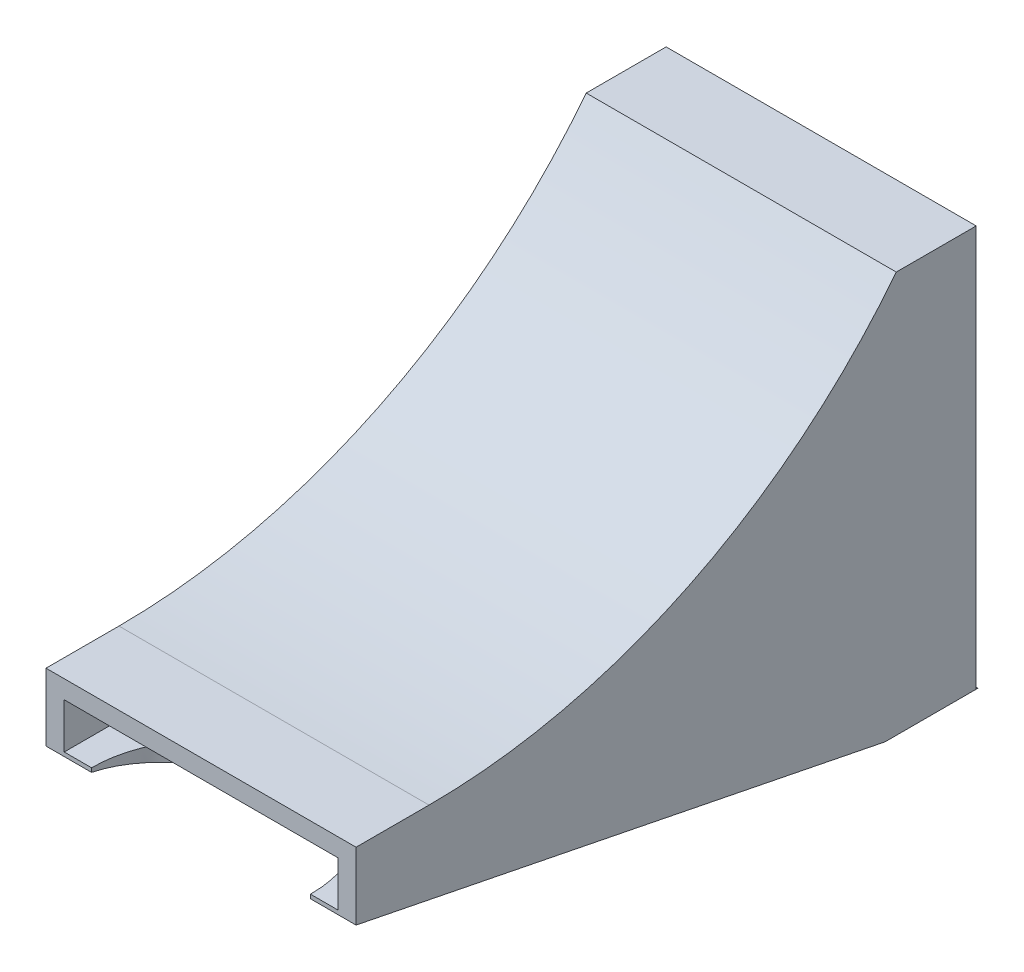
ISO-10303-21;
HEADER;
FILE_DESCRIPTION(('STEP AP214'),'2;1');
FILE_NAME('part.step','',(''),(''),'','','');
FILE_SCHEMA(('AUTOMOTIVE_DESIGN { 1 0 10303 214 1 1 1 1 }'));
ENDSEC;
DATA;
#1=APPLICATION_CONTEXT('core data for automotive mechanical design processes');
#2=APPLICATION_PROTOCOL_DEFINITION('international standard','automotive_design',2000,#1);
#3=PRODUCT_CONTEXT('',#1,'mechanical');
#4=PRODUCT('Part','Part','',(#3));
#5=PRODUCT_RELATED_PRODUCT_CATEGORY('part','',(#4));
#6=PRODUCT_DEFINITION_FORMATION('','',#4);
#7=PRODUCT_DEFINITION_CONTEXT('part definition',#1,'design');
#8=PRODUCT_DEFINITION('design','',#6,#7);
#9=PRODUCT_DEFINITION_SHAPE('','',#8);
#10=(LENGTH_UNIT() NAMED_UNIT(*) SI_UNIT(.MILLI.,.METRE.));
#11=(NAMED_UNIT(*) PLANE_ANGLE_UNIT() SI_UNIT($,.RADIAN.));
#12=(NAMED_UNIT(*) SI_UNIT($,.STERADIAN.) SOLID_ANGLE_UNIT());
#13=UNCERTAINTY_MEASURE_WITH_UNIT(LENGTH_MEASURE(1.E-05),#10,'distance_accuracy_value','');
#14=(GEOMETRIC_REPRESENTATION_CONTEXT(3) GLOBAL_UNCERTAINTY_ASSIGNED_CONTEXT((#13)) GLOBAL_UNIT_ASSIGNED_CONTEXT((#10,
#11,#12)) REPRESENTATION_CONTEXT('',''));
#15=CARTESIAN_POINT('',(0.,0.,0.));
#16=DIRECTION('',(0.,0.,1.));
#17=DIRECTION('',(1.,0.,0.));
#18=AXIS2_PLACEMENT_3D('',#15,#16,#17);
#19=CARTESIAN_POINT('',(-7.5,-4.98019609728144,34.));
#20=DIRECTION('',(0.,1.,0.));
#21=DIRECTION('',(0.,0.,1.));
#22=AXIS2_PLACEMENT_3D('',#19,#20,#21);
#23=PLANE('',#22);
#24=CARTESIAN_POINT('',(0.,-4.98019609728144,33.9560392194563));
#25=DIRECTION('',(0.,1.,0.));
#26=DIRECTION('',(0.,0.,1.));
#27=AXIS2_PLACEMENT_3D('',#24,#25,#26);
#28=ELLIPSE('',#27,6.11882341631134,6.);
#29=CARTESIAN_POINT('',(4.57730119659495,-4.98019609728144,30.));
#30=VERTEX_POINT('',#29);
#31=CARTESIAN_POINT('',(5.99984514622075,-4.98019609728144,34.));
#32=VERTEX_POINT('',#31);
#33=EDGE_CURVE('E171',#30,#32,#28,.F.);
#34=ORIENTED_EDGE('',*,*,#33,.T.);
#35=DIRECTION('',(1.,0.,0.));
#36=VECTOR('',#35,1.);
#37=CARTESIAN_POINT('',(-7.5,-4.98019609728144,34.));
#38=LINE('',#37,#36);
#39=CARTESIAN_POINT('',(7.5,-4.98019609728144,34.));
#40=VERTEX_POINT('',#39);
#41=EDGE_CURVE('E180',#32,#40,#38,.T.);
#42=ORIENTED_EDGE('',*,*,#41,.T.);
#43=DIRECTION('',(0.,0.,-1.));
#44=VECTOR('',#43,1.);
#45=CARTESIAN_POINT('',(7.5,-4.98019609728144,34.));
#46=LINE('',#45,#44);
#47=CARTESIAN_POINT('',(7.5,-4.98019609728144,30.));
#48=VERTEX_POINT('',#47);
#49=EDGE_CURVE('E201',#40,#48,#46,.T.);
#50=ORIENTED_EDGE('',*,*,#49,.T.);
#51=DIRECTION('',(-1.,0.,0.));
#52=VECTOR('',#51,1.);
#53=CARTESIAN_POINT('',(8.49999999999999,-4.98019609728144,30.));
#54=LINE('',#53,#52);
#55=EDGE_CURVE('E232',#48,#30,#54,.T.);
#56=ORIENTED_EDGE('',*,*,#55,.T.);
#57=EDGE_LOOP('',(#34,#42,#50,#56));
#58=FACE_BOUND('',#57,.T.);
#59=ADVANCED_FACE('F33',(#58),#23,.T.);
#60=CARTESIAN_POINT('',(0.,0.,0.));
#61=DIRECTION('',(0.,0.,-1.));
#62=DIRECTION('',(-1.,0.,0.));
#63=AXIS2_PLACEMENT_3D('',#60,#61,#62);
#64=PLANE('',#63);
#65=DIRECTION('',(1.,0.,0.));
#66=VECTOR('',#65,1.);
#67=CARTESIAN_POINT('',(0.,-10.9801960972814,0.));
#68=LINE('',#67,#66);
#69=CARTESIAN_POINT('',(-8.50000000000001,-10.9801960972814,0.));
#70=VERTEX_POINT('',#69);
#71=CARTESIAN_POINT('',(8.49999999999999,-10.9801960972814,0.));
#72=VERTEX_POINT('',#71);
#73=EDGE_CURVE('E239',#70,#72,#68,.T.);
#74=ORIENTED_EDGE('',*,*,#73,.F.);
#75=DIRECTION('',(0.,-1.,0.));
#76=VECTOR('',#75,1.);
#77=CARTESIAN_POINT('',(-8.50000000000001,-11.,0.));
#78=LINE('',#77,#76);
#79=CARTESIAN_POINT('',(-8.50000000000001,11.,0.));
#80=VERTEX_POINT('',#79);
#81=EDGE_CURVE('E291',#80,#70,#78,.T.);
#82=ORIENTED_EDGE('',*,*,#81,.F.);
#83=DIRECTION('',(-1.,0.,0.));
#84=VECTOR('',#83,1.);
#85=CARTESIAN_POINT('',(-8.50000000000001,11.,0.));
#86=LINE('',#85,#84);
#87=CARTESIAN_POINT('',(8.49999999999999,11.,0.));
#88=VERTEX_POINT('',#87);
#89=EDGE_CURVE('E288',#88,#80,#86,.T.);
#90=ORIENTED_EDGE('',*,*,#89,.F.);
#91=DIRECTION('',(0.,1.,0.));
#92=VECTOR('',#91,1.);
#93=CARTESIAN_POINT('',(8.49999999999999,-11.,0.));
#94=LINE('',#93,#92);
#95=EDGE_CURVE('E286',#72,#88,#94,.T.);
#96=ORIENTED_EDGE('',*,*,#95,.F.);
#97=EDGE_LOOP('',(#74,#82,#90,#96));
#98=FACE_BOUND('',#97,.T.);
#99=DIRECTION('',(1.,0.,0.));
#100=VECTOR('',#99,1.);
#101=CARTESIAN_POINT('',(-7.5,-10.,0.));
#102=LINE('',#101,#100);
#103=CARTESIAN_POINT('',(-7.5,-10.,0.));
#104=VERTEX_POINT('',#103);
#105=CARTESIAN_POINT('',(7.5,-10.,0.));
#106=VERTEX_POINT('',#105);
#107=EDGE_CURVE('E275',#104,#106,#102,.T.);
#108=ORIENTED_EDGE('',*,*,#107,.T.);
#109=DIRECTION('',(0.,1.,0.));
#110=VECTOR('',#109,1.);
#111=CARTESIAN_POINT('',(7.5,10.,0.));
#112=LINE('',#111,#110);
#113=CARTESIAN_POINT('',(7.5,10.,0.));
#114=VERTEX_POINT('',#113);
#115=EDGE_CURVE('E266',#106,#114,#112,.T.);
#116=ORIENTED_EDGE('',*,*,#115,.T.);
#117=DIRECTION('',(-1.,0.,0.));
#118=VECTOR('',#117,1.);
#119=CARTESIAN_POINT('',(-7.5,10.,0.));
#120=LINE('',#119,#118);
#121=CARTESIAN_POINT('',(-7.5,10.,0.));
#122=VERTEX_POINT('',#121);
#123=EDGE_CURVE('E269',#114,#122,#120,.T.);
#124=ORIENTED_EDGE('',*,*,#123,.T.);
#125=DIRECTION('',(0.,-1.,0.));
#126=VECTOR('',#125,1.);
#127=CARTESIAN_POINT('',(-7.5,10.,0.));
#128=LINE('',#127,#126);
#129=EDGE_CURVE('E272',#122,#104,#128,.T.);
#130=ORIENTED_EDGE('',*,*,#129,.T.);
#131=EDGE_LOOP('',(#108,#116,#124,#130));
#132=FACE_BOUND('',#131,.T.);
#133=ADVANCED_FACE('F324',(#98,#132),#64,.T.);
#134=CARTESIAN_POINT('',(8.49999999999999,-11.,30.));
#135=DIRECTION('',(-1.,0.,0.));
#136=DIRECTION('',(0.,0.,1.));
#137=AXIS2_PLACEMENT_3D('',#134,#135,#136);
#138=PLANE('',#137);
#139=DIRECTION('',(0.,1.,0.));
#140=VECTOR('',#139,1.);
#141=CARTESIAN_POINT('',(8.49999999999999,-1.5,34.));
#142=LINE('',#141,#140);
#143=CARTESIAN_POINT('',(8.49999999999999,-5.2,34.));
#144=VERTEX_POINT('',#143);
#145=CARTESIAN_POINT('',(8.49999999999999,-1.5,34.));
#146=VERTEX_POINT('',#145);
#147=EDGE_CURVE('E211',#144,#146,#142,.T.);
#148=ORIENTED_EDGE('',*,*,#147,.F.);
#149=DIRECTION('',(0.,-0.196116135138184,-0.98058067569092));
#150=VECTOR('',#149,1.);
#151=CARTESIAN_POINT('',(8.49999999999999,-11.,5.));
#152=LINE('',#151,#150);
#153=CARTESIAN_POINT('',(8.49999999999999,-11.,5.));
#154=VERTEX_POINT('',#153);
#155=EDGE_CURVE('E184',#144,#154,#152,.T.);
#156=ORIENTED_EDGE('',*,*,#155,.T.);
#157=DIRECTION('',(0.,0.,-1.));
#158=VECTOR('',#157,1.);
#159=CARTESIAN_POINT('',(8.49999999999999,-11.,30.));
#160=LINE('',#159,#158);
#161=CARTESIAN_POINT('',(8.49999999999999,-11.,-0.099019513592767));
#162=VERTEX_POINT('',#161);
#163=EDGE_CURVE('E294',#154,#162,#160,.T.);
#164=ORIENTED_EDGE('',*,*,#163,.T.);
#165=DIRECTION('',(0.,-0.196116135138184,-0.98058067569092));
#166=VECTOR('',#165,1.);
#167=CARTESIAN_POINT('',(8.49999999999999,-4.98019609728144,30.));
#168=LINE('',#167,#166);
#169=EDGE_CURVE('E222',#72,#162,#168,.T.);
#170=ORIENTED_EDGE('',*,*,#169,.F.);
#171=ORIENTED_EDGE('',*,*,#95,.T.);
#172=DIRECTION('',(0.,0.,-1.));
#173=VECTOR('',#172,1.);
#174=CARTESIAN_POINT('',(8.49999999999999,11.,30.));
#175=LINE('',#174,#173);
#176=CARTESIAN_POINT('',(8.49999999999999,11.,4.382623085101));
#177=VERTEX_POINT('',#176);
#178=EDGE_CURVE('E300',#177,#88,#175,.T.);
#179=ORIENTED_EDGE('',*,*,#178,.F.);
#180=CARTESIAN_POINT('',(8.49999999999999,31.,30.));
#181=DIRECTION('',(1.,0.,0.));
#182=DIRECTION('',(0.,0.,-1.));
#183=AXIS2_PLACEMENT_3D('',#180,#181,#182);
#184=CIRCLE('',#183,32.5);
#185=CARTESIAN_POINT('',(8.49999999999999,-1.5,30.));
#186=VERTEX_POINT('',#185);
#187=EDGE_CURVE('E255',#186,#177,#184,.T.);
#188=ORIENTED_EDGE('',*,*,#187,.F.);
#189=DIRECTION('',(0.,0.,-1.));
#190=VECTOR('',#189,1.);
#191=CARTESIAN_POINT('',(8.49999999999999,-1.5,34.));
#192=LINE('',#191,#190);
#193=EDGE_CURVE('E218',#146,#186,#192,.T.);
#194=ORIENTED_EDGE('',*,*,#193,.F.);
#195=EDGE_LOOP('',(#148,#156,#164,#170,#171,#179,#188,#194));
#196=FACE_BOUND('',#195,.T.);
#197=ADVANCED_FACE('F35',(#196),#138,.F.);
#198=CARTESIAN_POINT('',(-8.50000000000001,11.,30.));
#199=DIRECTION('',(0.,-1.,0.));
#200=DIRECTION('',(0.,0.,-1.));
#201=AXIS2_PLACEMENT_3D('',#198,#199,#200);
#202=PLANE('',#201);
#203=ORIENTED_EDGE('',*,*,#89,.T.);
#204=DIRECTION('',(0.,0.,-1.));
#205=VECTOR('',#204,1.);
#206=CARTESIAN_POINT('',(-8.50000000000001,11.,30.));
#207=LINE('',#206,#205);
#208=CARTESIAN_POINT('',(-8.50000000000001,11.,4.382623085101));
#209=VERTEX_POINT('',#208);
#210=EDGE_CURVE('E298',#209,#80,#207,.T.);
#211=ORIENTED_EDGE('',*,*,#210,.F.);
#212=DIRECTION('',(1.,0.,0.));
#213=VECTOR('',#212,1.);
#214=CARTESIAN_POINT('',(-8.50000000000001,11.,4.382623085101));
#215=LINE('',#214,#213);
#216=EDGE_CURVE('E263',#209,#177,#215,.T.);
#217=ORIENTED_EDGE('',*,*,#216,.T.);
#218=ORIENTED_EDGE('',*,*,#178,.T.);
#219=EDGE_LOOP('',(#203,#211,#217,#218));
#220=FACE_BOUND('',#219,.T.);
#221=ADVANCED_FACE('F412',(#220),#202,.F.);
#222=CARTESIAN_POINT('',(-8.50000000000001,-11.,30.));
#223=DIRECTION('',(1.,0.,0.));
#224=DIRECTION('',(0.,0.,-1.));
#225=AXIS2_PLACEMENT_3D('',#222,#223,#224);
#226=PLANE('',#225);
#227=DIRECTION('',(0.,-0.196116135138184,-0.98058067569092));
#228=VECTOR('',#227,1.);
#229=CARTESIAN_POINT('',(-8.50000000000001,-11.,5.));
#230=LINE('',#229,#228);
#231=CARTESIAN_POINT('',(-8.50000000000001,-5.2,34.));
#232=VERTEX_POINT('',#231);
#233=CARTESIAN_POINT('',(-8.50000000000001,-11.,5.));
#234=VERTEX_POINT('',#233);
#235=EDGE_CURVE('E241',#232,#234,#230,.T.);
#236=ORIENTED_EDGE('',*,*,#235,.F.);
#237=DIRECTION('',(0.,-1.,0.));
#238=VECTOR('',#237,1.);
#239=CARTESIAN_POINT('',(-8.50000000000001,-6.,34.));
#240=LINE('',#239,#238);
#241=CARTESIAN_POINT('',(-8.50000000000001,-1.5,34.));
#242=VERTEX_POINT('',#241);
#243=EDGE_CURVE('E208',#242,#232,#240,.T.);
#244=ORIENTED_EDGE('',*,*,#243,.F.);
#245=DIRECTION('',(0.,0.,-1.));
#246=VECTOR('',#245,1.);
#247=CARTESIAN_POINT('',(-8.50000000000001,-1.5,34.));
#248=LINE('',#247,#246);
#249=CARTESIAN_POINT('',(-8.50000000000001,-1.5,30.));
#250=VERTEX_POINT('',#249);
#251=EDGE_CURVE('E215',#242,#250,#248,.T.);
#252=ORIENTED_EDGE('',*,*,#251,.T.);
#253=CARTESIAN_POINT('',(-8.50000000000001,31.,30.));
#254=DIRECTION('',(1.,0.,0.));
#255=DIRECTION('',(0.,0.,-1.));
#256=AXIS2_PLACEMENT_3D('',#253,#254,#255);
#257=CIRCLE('',#256,32.5);
#258=EDGE_CURVE('E256',#250,#209,#257,.T.);
#259=ORIENTED_EDGE('',*,*,#258,.T.);
#260=ORIENTED_EDGE('',*,*,#210,.T.);
#261=ORIENTED_EDGE('',*,*,#81,.T.);
#262=DIRECTION('',(0.,-0.196116135138184,-0.98058067569092));
#263=VECTOR('',#262,1.);
#264=CARTESIAN_POINT('',(-8.50000000000001,-4.98019609728144,30.));
#265=LINE('',#264,#263);
#266=CARTESIAN_POINT('',(-8.50000000000001,-11.,-0.099019513592767));
#267=VERTEX_POINT('',#266);
#268=EDGE_CURVE('E221',#70,#267,#265,.T.);
#269=ORIENTED_EDGE('',*,*,#268,.T.);
#270=DIRECTION('',(0.,0.,-1.));
#271=VECTOR('',#270,1.);
#272=CARTESIAN_POINT('',(-8.50000000000001,-11.,30.));
#273=LINE('',#272,#271);
#274=EDGE_CURVE('E296',#234,#267,#273,.T.);
#275=ORIENTED_EDGE('',*,*,#274,.F.);
#276=EDGE_LOOP('',(#236,#244,#252,#259,#260,#261,#269,#275));
#277=FACE_BOUND('',#276,.T.);
#278=ADVANCED_FACE('F406',(#277),#226,.F.);
#279=CARTESIAN_POINT('',(-8.50000000000001,-11.,30.));
#280=DIRECTION('',(0.,1.,0.));
#281=DIRECTION('',(0.,0.,1.));
#282=AXIS2_PLACEMENT_3D('',#279,#280,#281);
#283=PLANE('',#282);
#284=ORIENTED_EDGE('',*,*,#163,.F.);
#285=DIRECTION('',(-1.,0.,0.));
#286=VECTOR('',#285,1.);
#287=CARTESIAN_POINT('',(8.49999999999999,-11.,5.));
#288=LINE('',#287,#286);
#289=EDGE_CURVE('E243',#154,#234,#288,.T.);
#290=ORIENTED_EDGE('',*,*,#289,.T.);
#291=ORIENTED_EDGE('',*,*,#274,.T.);
#292=DIRECTION('',(-1.,0.,0.));
#293=VECTOR('',#292,1.);
#294=CARTESIAN_POINT('',(8.49999999999999,-11.,-0.099019513592767));
#295=LINE('',#294,#293);
#296=EDGE_CURVE('E228',#162,#267,#295,.T.);
#297=ORIENTED_EDGE('',*,*,#296,.F.);
#298=EDGE_LOOP('',(#284,#290,#291,#297));
#299=FACE_BOUND('',#298,.T.);
#300=ADVANCED_FACE('F411',(#299),#283,.F.);
#301=CARTESIAN_POINT('',(7.5,10.,30.));
#302=DIRECTION('',(-1.,0.,0.));
#303=DIRECTION('',(0.,0.,1.));
#304=AXIS2_PLACEMENT_3D('',#301,#302,#303);
#305=PLANE('',#304);
#306=DIRECTION('',(0.,-0.196116135138184,-0.98058067569092));
#307=VECTOR('',#306,1.);
#308=CARTESIAN_POINT('',(7.5,-4.40403470892446,32.8808069417849));
#309=LINE('',#308,#307);
#310=CARTESIAN_POINT('',(7.5,-10.,4.90098048640723));
#311=VERTEX_POINT('',#310);
#312=EDGE_CURVE('E237',#48,#311,#309,.T.);
#313=ORIENTED_EDGE('',*,*,#312,.F.);
#314=ORIENTED_EDGE('',*,*,#49,.F.);
#315=DIRECTION('',(0.,1.,0.));
#316=VECTOR('',#315,1.);
#317=CARTESIAN_POINT('',(7.5,-4.98019609728144,34.));
#318=LINE('',#317,#316);
#319=CARTESIAN_POINT('',(7.5,-2.50000000000001,34.));
#320=VERTEX_POINT('',#319);
#321=EDGE_CURVE('E198',#40,#320,#318,.T.);
#322=ORIENTED_EDGE('',*,*,#321,.T.);
#323=DIRECTION('',(0.,0.,-1.));
#324=VECTOR('',#323,1.);
#325=CARTESIAN_POINT('',(7.5,-2.50000000000001,34.));
#326=LINE('',#325,#324);
#327=CARTESIAN_POINT('',(7.5,-2.50000000000001,30.));
#328=VERTEX_POINT('',#327);
#329=EDGE_CURVE('E56',#320,#328,#326,.T.);
#330=ORIENTED_EDGE('',*,*,#329,.T.);
#331=CARTESIAN_POINT('',(7.5,31.,30.));
#332=DIRECTION('',(-1.,0.,0.));
#333=DIRECTION('',(0.,0.,1.));
#334=AXIS2_PLACEMENT_3D('',#331,#332,#333);
#335=CIRCLE('',#334,33.5);
#336=CARTESIAN_POINT('',(7.5,10.,3.89923372772362));
#337=VERTEX_POINT('',#336);
#338=EDGE_CURVE('E252',#337,#328,#335,.T.);
#339=ORIENTED_EDGE('',*,*,#338,.F.);
#340=DIRECTION('',(0.,0.,-1.));
#341=VECTOR('',#340,1.);
#342=CARTESIAN_POINT('',(7.5,10.,30.));
#343=LINE('',#342,#341);
#344=EDGE_CURVE('E284',#337,#114,#343,.T.);
#345=ORIENTED_EDGE('',*,*,#344,.T.);
#346=ORIENTED_EDGE('',*,*,#115,.F.);
#347=DIRECTION('',(0.,0.,-1.));
#348=VECTOR('',#347,1.);
#349=CARTESIAN_POINT('',(7.5,-10.,30.));
#350=LINE('',#349,#348);
#351=EDGE_CURVE('E278',#311,#106,#350,.T.);
#352=ORIENTED_EDGE('',*,*,#351,.F.);
#353=EDGE_LOOP('',(#313,#314,#322,#330,#339,#345,#346,#352));
#354=FACE_BOUND('',#353,.T.);
#355=ADVANCED_FACE('F320',(#354),#305,.T.);
#356=CARTESIAN_POINT('',(-7.5,10.,30.));
#357=DIRECTION('',(0.,-1.,0.));
#358=DIRECTION('',(0.,0.,-1.));
#359=AXIS2_PLACEMENT_3D('',#356,#357,#358);
#360=PLANE('',#359);
#361=DIRECTION('',(1.,0.,0.));
#362=VECTOR('',#361,1.);
#363=CARTESIAN_POINT('',(-8.50000000000001,10.,3.89923372772362));
#364=LINE('',#363,#362);
#365=CARTESIAN_POINT('',(-7.5,10.,3.89923372772362));
#366=VERTEX_POINT('',#365);
#367=EDGE_CURVE('E249',#366,#337,#364,.T.);
#368=ORIENTED_EDGE('',*,*,#367,.F.);
#369=DIRECTION('',(0.,0.,-1.));
#370=VECTOR('',#369,1.);
#371=CARTESIAN_POINT('',(-7.5,10.,30.));
#372=LINE('',#371,#370);
#373=EDGE_CURVE('E282',#366,#122,#372,.T.);
#374=ORIENTED_EDGE('',*,*,#373,.T.);
#375=ORIENTED_EDGE('',*,*,#123,.F.);
#376=ORIENTED_EDGE('',*,*,#344,.F.);
#377=EDGE_LOOP('',(#368,#374,#375,#376));
#378=FACE_BOUND('',#377,.T.);
#379=ADVANCED_FACE('F316',(#378),#360,.T.);
#380=CARTESIAN_POINT('',(-7.5,10.,30.));
#381=DIRECTION('',(1.,0.,0.));
#382=DIRECTION('',(0.,1.,0.));
#383=AXIS2_PLACEMENT_3D('',#380,#381,#382);
#384=PLANE('',#383);
#385=DIRECTION('',(0.,0.196116135138184,0.98058067569092));
#386=VECTOR('',#385,1.);
#387=CARTESIAN_POINT('',(-7.5,-4.40403470892446,32.8808069417849));
#388=LINE('',#387,#386);
#389=CARTESIAN_POINT('',(-7.5,-10.,4.90098048640723));
#390=VERTEX_POINT('',#389);
#391=CARTESIAN_POINT('',(-7.5,-4.98019609728144,30.));
#392=VERTEX_POINT('',#391);
#393=EDGE_CURVE('E231',#390,#392,#388,.T.);
#394=ORIENTED_EDGE('',*,*,#393,.F.);
#395=DIRECTION('',(0.,0.,-1.));
#396=VECTOR('',#395,1.);
#397=CARTESIAN_POINT('',(-7.5,-10.,30.));
#398=LINE('',#397,#396);
#399=EDGE_CURVE('E280',#390,#104,#398,.T.);
#400=ORIENTED_EDGE('',*,*,#399,.T.);
#401=ORIENTED_EDGE('',*,*,#129,.F.);
#402=ORIENTED_EDGE('',*,*,#373,.F.);
#403=CARTESIAN_POINT('',(-7.50000000000001,31.,30.));
#404=DIRECTION('',(1.,0.,0.));
#405=DIRECTION('',(0.,1.,0.));
#406=AXIS2_PLACEMENT_3D('',#403,#404,#405);
#407=CIRCLE('',#406,33.5);
#408=CARTESIAN_POINT('',(-7.5,-2.50000000000001,30.));
#409=VERTEX_POINT('',#408);
#410=EDGE_CURVE('E41',#409,#366,#407,.T.);
#411=ORIENTED_EDGE('',*,*,#410,.F.);
#412=DIRECTION('',(0.,0.,-1.));
#413=VECTOR('',#412,1.);
#414=CARTESIAN_POINT('',(-7.5,-2.50000000000001,34.));
#415=LINE('',#414,#413);
#416=CARTESIAN_POINT('',(-7.5,-2.50000000000001,34.));
#417=VERTEX_POINT('',#416);
#418=EDGE_CURVE('E206',#417,#409,#415,.T.);
#419=ORIENTED_EDGE('',*,*,#418,.F.);
#420=DIRECTION('',(0.,-1.,0.));
#421=VECTOR('',#420,1.);
#422=CARTESIAN_POINT('',(-7.5,-2.50000000000001,34.));
#423=LINE('',#422,#421);
#424=CARTESIAN_POINT('',(-7.5,-4.98019609728144,34.));
#425=VERTEX_POINT('',#424);
#426=EDGE_CURVE('E188',#417,#425,#423,.T.);
#427=ORIENTED_EDGE('',*,*,#426,.T.);
#428=DIRECTION('',(0.,0.,-1.));
#429=VECTOR('',#428,1.);
#430=CARTESIAN_POINT('',(-7.5,-4.98019609728144,34.));
#431=LINE('',#430,#429);
#432=EDGE_CURVE('E203',#425,#392,#431,.T.);
#433=ORIENTED_EDGE('',*,*,#432,.T.);
#434=EDGE_LOOP('',(#394,#400,#401,#402,#411,#419,#427,#433));
#435=FACE_BOUND('',#434,.T.);
#436=ADVANCED_FACE('F311',(#435),#384,.T.);
#437=CARTESIAN_POINT('',(-7.5,-10.,30.));
#438=DIRECTION('',(0.,1.,0.));
#439=DIRECTION('',(0.,0.,1.));
#440=AXIS2_PLACEMENT_3D('',#437,#438,#439);
#441=PLANE('',#440);
#442=DIRECTION('',(-1.,0.,0.));
#443=VECTOR('',#442,1.);
#444=CARTESIAN_POINT('',(-7.5,-10.,4.90098048640723));
#445=LINE('',#444,#443);
#446=EDGE_CURVE('E11',#311,#390,#445,.T.);
#447=ORIENTED_EDGE('',*,*,#446,.F.);
#448=ORIENTED_EDGE('',*,*,#351,.T.);
#449=ORIENTED_EDGE('',*,*,#107,.F.);
#450=ORIENTED_EDGE('',*,*,#399,.F.);
#451=EDGE_LOOP('',(#447,#448,#449,#450));
#452=FACE_BOUND('',#451,.T.);
#453=ADVANCED_FACE('F328',(#452),#441,.T.);
#454=CARTESIAN_POINT('',(-8.50000000000001,31.,30.));
#455=DIRECTION('',(1.,0.,0.));
#456=DIRECTION('',(0.,0.,-1.));
#457=AXIS2_PLACEMENT_3D('',#454,#455,#456);
#458=CYLINDRICAL_SURFACE('',#457,32.5);
#459=ORIENTED_EDGE('',*,*,#258,.F.);
#460=DIRECTION('',(1.,0.,0.));
#461=VECTOR('',#460,1.);
#462=CARTESIAN_POINT('',(-8.50000000000001,-1.5,30.));
#463=LINE('',#462,#461);
#464=EDGE_CURVE('E259',#186,#250,#463,.F.);
#465=ORIENTED_EDGE('',*,*,#464,.F.);
#466=ORIENTED_EDGE('',*,*,#187,.T.);
#467=ORIENTED_EDGE('',*,*,#216,.F.);
#468=EDGE_LOOP('',(#459,#465,#466,#467));
#469=FACE_BOUND('',#468,.T.);
#470=ADVANCED_FACE('F440',(#469),#458,.F.);
#471=CARTESIAN_POINT('',(-8.50000000000001,31.,30.));
#472=DIRECTION('',(1.,0.,0.));
#473=DIRECTION('',(0.,0.,-1.));
#474=AXIS2_PLACEMENT_3D('',#471,#472,#473);
#475=CYLINDRICAL_SURFACE('',#474,33.5);
#476=ORIENTED_EDGE('',*,*,#367,.T.);
#477=ORIENTED_EDGE('',*,*,#338,.T.);
#478=DIRECTION('',(1.,0.,0.));
#479=VECTOR('',#478,1.);
#480=CARTESIAN_POINT('',(-8.50000000000001,-2.50000000000001,30.));
#481=LINE('',#480,#479);
#482=EDGE_CURVE('E247',#409,#328,#481,.T.);
#483=ORIENTED_EDGE('',*,*,#482,.F.);
#484=ORIENTED_EDGE('',*,*,#410,.T.);
#485=EDGE_LOOP('',(#476,#477,#483,#484));
#486=FACE_BOUND('',#485,.T.);
#487=ADVANCED_FACE('F306',(#486),#475,.T.);
#488=CARTESIAN_POINT('',(8.49999999999999,-11.,5.));
#489=DIRECTION('',(0.,0.98058067569092,-0.196116135138184));
#490=DIRECTION('',(0.,0.196116135138184,0.98058067569092));
#491=AXIS2_PLACEMENT_3D('',#488,#489,#490);
#492=PLANE('',#491);
#493=DIRECTION('',(-1.,0.,0.));
#494=VECTOR('',#493,1.);
#495=CARTESIAN_POINT('',(8.49999999999999,-5.2,34.));
#496=LINE('',#495,#494);
#497=CARTESIAN_POINT('',(6.,-5.2,34.));
#498=VERTEX_POINT('',#497);
#499=EDGE_CURVE('E177',#144,#498,#496,.T.);
#500=ORIENTED_EDGE('',*,*,#499,.T.);
#501=CARTESIAN_POINT('',(0.,-5.2,34.));
#502=DIRECTION('',(0.,-0.98058067569092,0.196116135138184));
#503=DIRECTION('',(0.,-0.196116135138184,-0.98058067569092));
#504=AXIS2_PLACEMENT_3D('',#501,#502,#503);
#505=CIRCLE('',#504,6.);
#506=CARTESIAN_POINT('',(-6.00000000000001,-5.2,34.));
#507=VERTEX_POINT('',#506);
#508=EDGE_CURVE('E161',#507,#498,#505,.T.);
#509=ORIENTED_EDGE('',*,*,#508,.F.);
#510=EDGE_CURVE('E186',#507,#232,#496,.T.);
#511=ORIENTED_EDGE('',*,*,#510,.T.);
#512=ORIENTED_EDGE('',*,*,#235,.T.);
#513=ORIENTED_EDGE('',*,*,#289,.F.);
#514=ORIENTED_EDGE('',*,*,#155,.F.);
#515=EDGE_LOOP('',(#500,#509,#511,#512,#513,#514));
#516=FACE_BOUND('',#515,.T.);
#517=ADVANCED_FACE('F182',(#516),#492,.F.);
#518=CARTESIAN_POINT('',(8.49999999999999,-4.98019609728144,30.));
#519=DIRECTION('',(0.,0.98058067569092,-0.196116135138184));
#520=DIRECTION('',(0.,0.196116135138184,0.98058067569092));
#521=AXIS2_PLACEMENT_3D('',#518,#519,#520);
#522=PLANE('',#521);
#523=CARTESIAN_POINT('',(0.,-4.21941932430907,33.8038838648618));
#524=DIRECTION('',(0.,0.98058067569092,-0.196116135138184));
#525=DIRECTION('',(0.,0.196116135138184,0.98058067569092));
#526=AXIS2_PLACEMENT_3D('',#523,#524,#525);
#527=CIRCLE('',#526,6.);
#528=CARTESIAN_POINT('',(-4.57730119659497,-4.98019609728144,30.));
#529=VERTEX_POINT('',#528);
#530=EDGE_CURVE('E48',#529,#30,#527,.F.);
#531=ORIENTED_EDGE('',*,*,#530,.T.);
#532=ORIENTED_EDGE('',*,*,#55,.F.);
#533=ORIENTED_EDGE('',*,*,#312,.T.);
#534=ORIENTED_EDGE('',*,*,#446,.T.);
#535=ORIENTED_EDGE('',*,*,#393,.T.);
#536=EDGE_CURVE('E225',#529,#392,#54,.T.);
#537=ORIENTED_EDGE('',*,*,#536,.F.);
#538=EDGE_LOOP('',(#531,#532,#533,#534,#535,#537));
#539=FACE_BOUND('',#538,.T.);
#540=ADVANCED_FACE('F330',(#539),#522,.T.);
#541=ORIENTED_EDGE('',*,*,#268,.F.);
#542=ORIENTED_EDGE('',*,*,#73,.T.);
#543=ORIENTED_EDGE('',*,*,#169,.T.);
#544=ORIENTED_EDGE('',*,*,#296,.T.);
#545=EDGE_LOOP('',(#541,#542,#543,#544));
#546=FACE_BOUND('',#545,.T.);
#547=ADVANCED_FACE('F380',(#546),#522,.T.);
#548=CARTESIAN_POINT('',(0.,0.,34.));
#549=DIRECTION('',(0.,0.,-1.));
#550=DIRECTION('',(-1.,0.,0.));
#551=AXIS2_PLACEMENT_3D('',#548,#549,#550);
#552=PLANE('',#551);
#553=ORIENTED_EDGE('',*,*,#510,.F.);
#554=CARTESIAN_POINT('',(0.,-5.19999999999997,34.));
#555=DIRECTION('',(0.,0.,-1.));
#556=DIRECTION('',(0.,-1.,0.));
#557=AXIS2_PLACEMENT_3D('',#554,#555,#556);
#558=ELLIPSE('',#557,30.5941170815567,6.);
#559=CARTESIAN_POINT('',(-5.99984514622077,-4.98019609728144,34.));
#560=VERTEX_POINT('',#559);
#561=EDGE_CURVE('E167',#560,#507,#558,.F.);
#562=ORIENTED_EDGE('',*,*,#561,.F.);
#563=EDGE_CURVE('E195',#425,#560,#38,.T.);
#564=ORIENTED_EDGE('',*,*,#563,.F.);
#565=ORIENTED_EDGE('',*,*,#426,.F.);
#566=DIRECTION('',(-1.,0.,0.));
#567=VECTOR('',#566,1.);
#568=CARTESIAN_POINT('',(7.5,-2.50000000000001,34.));
#569=LINE('',#568,#567);
#570=EDGE_CURVE('E185',#320,#417,#569,.T.);
#571=ORIENTED_EDGE('',*,*,#570,.F.);
#572=ORIENTED_EDGE('',*,*,#321,.F.);
#573=ORIENTED_EDGE('',*,*,#41,.F.);
#574=EDGE_CURVE('E164',#498,#32,#558,.F.);
#575=ORIENTED_EDGE('',*,*,#574,.F.);
#576=ORIENTED_EDGE('',*,*,#499,.F.);
#577=ORIENTED_EDGE('',*,*,#147,.T.);
#578=DIRECTION('',(-1.,0.,0.));
#579=VECTOR('',#578,1.);
#580=CARTESIAN_POINT('',(-8.50000000000001,-1.5,34.));
#581=LINE('',#580,#579);
#582=EDGE_CURVE('E213',#146,#242,#581,.T.);
#583=ORIENTED_EDGE('',*,*,#582,.T.);
#584=ORIENTED_EDGE('',*,*,#243,.T.);
#585=EDGE_LOOP('',(#553,#562,#564,#565,#571,#572,#573,#575,#576,#577,#583,#584));
#586=FACE_BOUND('',#585,.T.);
#587=ADVANCED_FACE('F176',(#586),#552,.F.);
#588=CARTESIAN_POINT('',(-8.50000000000001,-1.5,34.));
#589=DIRECTION('',(0.,-1.,0.));
#590=DIRECTION('',(0.,0.,-1.));
#591=AXIS2_PLACEMENT_3D('',#588,#589,#590);
#592=PLANE('',#591);
#593=ORIENTED_EDGE('',*,*,#464,.T.);
#594=ORIENTED_EDGE('',*,*,#251,.F.);
#595=ORIENTED_EDGE('',*,*,#582,.F.);
#596=ORIENTED_EDGE('',*,*,#193,.T.);
#597=EDGE_LOOP('',(#593,#594,#595,#596));
#598=FACE_BOUND('',#597,.T.);
#599=ADVANCED_FACE('F343',(#598),#592,.F.);
#600=CARTESIAN_POINT('',(7.5,-2.50000000000001,34.));
#601=DIRECTION('',(0.,-1.,0.));
#602=DIRECTION('',(0.,0.,-1.));
#603=AXIS2_PLACEMENT_3D('',#600,#601,#602);
#604=PLANE('',#603);
#605=ORIENTED_EDGE('',*,*,#482,.T.);
#606=ORIENTED_EDGE('',*,*,#329,.F.);
#607=ORIENTED_EDGE('',*,*,#570,.T.);
#608=ORIENTED_EDGE('',*,*,#418,.T.);
#609=EDGE_LOOP('',(#605,#606,#607,#608));
#610=FACE_BOUND('',#609,.T.);
#611=ADVANCED_FACE('F341',(#610),#604,.T.);
#612=EDGE_CURVE('E190',#560,#529,#28,.F.);
#613=ORIENTED_EDGE('',*,*,#612,.T.);
#614=ORIENTED_EDGE('',*,*,#536,.T.);
#615=ORIENTED_EDGE('',*,*,#432,.F.);
#616=ORIENTED_EDGE('',*,*,#563,.T.);
#617=EDGE_LOOP('',(#613,#614,#615,#616));
#618=FACE_BOUND('',#617,.T.);
#619=ADVANCED_FACE('F336',(#618),#23,.T.);
#620=CARTESIAN_POINT('',(0.,16.9355806756909,29.5728838648618));
#621=DIRECTION('',(0.,-0.98058067569092,0.196116135138184));
#622=DIRECTION('',(0.,-0.196116135138184,-0.98058067569092));
#623=AXIS2_PLACEMENT_3D('',#620,#621,#622);
#624=CYLINDRICAL_SURFACE('',#623,6.);
#625=ORIENTED_EDGE('',*,*,#561,.T.);
#626=ORIENTED_EDGE('',*,*,#508,.T.);
#627=ORIENTED_EDGE('',*,*,#574,.T.);
#628=ORIENTED_EDGE('',*,*,#33,.F.);
#629=ORIENTED_EDGE('',*,*,#530,.F.);
#630=ORIENTED_EDGE('',*,*,#612,.F.);
#631=EDGE_LOOP('',(#625,#626,#627,#628,#629,#630));
#632=FACE_BOUND('',#631,.T.);
#633=ADVANCED_FACE('F163',(#632),#624,.F.);
#634=CLOSED_SHELL('',(#59,#133,#197,#221,#278,#300,#355,#379,#436,#453,#470,#487,#517,#540,#547,
#587,#599,#611,#619,#633));
#635=MANIFOLD_SOLID_BREP('B2',#634);
#636=ADVANCED_BREP_SHAPE_REPRESENTATION('',(#18,#635),#14);
#637=SHAPE_DEFINITION_REPRESENTATION(#9,#636);
ENDSEC;
END-ISO-10303-21;
